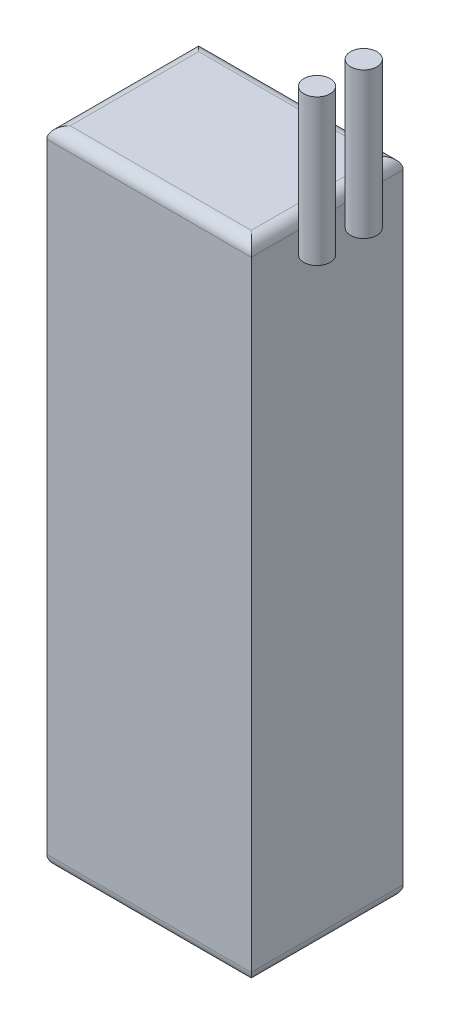
ISO-10303-21;
HEADER;
FILE_DESCRIPTION(('STEP AP214'),'2;1');
FILE_NAME('part.step','',(''),(''),'','','');
FILE_SCHEMA(('AUTOMOTIVE_DESIGN { 1 0 10303 214 1 1 1 1 }'));
ENDSEC;
DATA;
#1=APPLICATION_CONTEXT('core data for automotive mechanical design processes');
#2=APPLICATION_PROTOCOL_DEFINITION('international standard','automotive_design',2000,#1);
#3=PRODUCT_CONTEXT('',#1,'mechanical');
#4=PRODUCT('Part','Part','',(#3));
#5=PRODUCT_RELATED_PRODUCT_CATEGORY('part','',(#4));
#6=PRODUCT_DEFINITION_FORMATION('','',#4);
#7=PRODUCT_DEFINITION_CONTEXT('part definition',#1,'design');
#8=PRODUCT_DEFINITION('design','',#6,#7);
#9=PRODUCT_DEFINITION_SHAPE('','',#8);
#10=(LENGTH_UNIT() NAMED_UNIT(*) SI_UNIT(.MILLI.,.METRE.));
#11=(NAMED_UNIT(*) PLANE_ANGLE_UNIT() SI_UNIT($,.RADIAN.));
#12=(NAMED_UNIT(*) SI_UNIT($,.STERADIAN.) SOLID_ANGLE_UNIT());
#13=UNCERTAINTY_MEASURE_WITH_UNIT(LENGTH_MEASURE(1.E-05),#10,'distance_accuracy_value','');
#14=(GEOMETRIC_REPRESENTATION_CONTEXT(3) GLOBAL_UNCERTAINTY_ASSIGNED_CONTEXT((#13)) GLOBAL_UNIT_ASSIGNED_CONTEXT((#10,
#11,#12)) REPRESENTATION_CONTEXT('',''));
#15=CARTESIAN_POINT('',(0.,0.,0.));
#16=DIRECTION('',(0.,0.,1.));
#17=DIRECTION('',(1.,0.,0.));
#18=AXIS2_PLACEMENT_3D('',#15,#16,#17);
#19=CARTESIAN_POINT('',(19.75,105.,4.));
#20=DIRECTION('',(0.,1.,0.));
#21=DIRECTION('',(0.,0.,1.));
#22=AXIS2_PLACEMENT_3D('',#19,#20,#21);
#23=CYLINDRICAL_SURFACE('',#22,2.25);
#24=CARTESIAN_POINT('',(19.75,105.,4.));
#25=DIRECTION('',(0.,1.,0.));
#26=DIRECTION('',(0.,0.,-1.));
#27=AXIS2_PLACEMENT_3D('',#24,#25,#26);
#28=CIRCLE('',#27,2.25);
#29=CARTESIAN_POINT('',(19.75,105.,1.75));
#30=VERTEX_POINT('',#29);
#31=EDGE_CURVE('E11',#30,#30,#28,.T.);
#32=ORIENTED_EDGE('',*,*,#31,.T.);
#33=EDGE_LOOP('',(#32));
#34=FACE_BOUND('',#33,.T.);
#35=CARTESIAN_POINT('',(19.75,130.,4.));
#36=DIRECTION('',(0.,1.,0.));
#37=DIRECTION('',(0.,0.,-1.));
#38=AXIS2_PLACEMENT_3D('',#35,#36,#37);
#39=CIRCLE('',#38,2.25);
#40=CARTESIAN_POINT('',(19.75,130.,1.75));
#41=VERTEX_POINT('',#40);
#42=EDGE_CURVE('E53',#41,#41,#39,.T.);
#43=ORIENTED_EDGE('',*,*,#42,.F.);
#44=EDGE_LOOP('',(#43));
#45=FACE_BOUND('',#44,.T.);
#46=ADVANCED_FACE('F47',(#34,#45),#23,.T.);
#47=CARTESIAN_POINT('',(19.75,105.,4.));
#48=DIRECTION('',(0.,-1.,0.));
#49=DIRECTION('',(0.,0.,-1.));
#50=AXIS2_PLACEMENT_3D('',#47,#48,#49);
#51=PLANE('',#50);
#52=ORIENTED_EDGE('',*,*,#31,.F.);
#53=EDGE_LOOP('',(#52));
#54=FACE_BOUND('',#53,.T.);
#55=ADVANCED_FACE('F62',(#54),#51,.T.);
#56=CARTESIAN_POINT('',(19.75,130.,4.));
#57=DIRECTION('',(0.,-1.,0.));
#58=DIRECTION('',(0.,0.,-1.));
#59=AXIS2_PLACEMENT_3D('',#56,#57,#58);
#60=PLANE('',#59);
#61=ORIENTED_EDGE('',*,*,#42,.T.);
#62=EDGE_LOOP('',(#61));
#63=FACE_BOUND('',#62,.T.);
#64=ADVANCED_FACE('F59',(#63),#60,.F.);
#65=CLOSED_SHELL('',(#46,#55,#64));
#66=MANIFOLD_SOLID_BREP('B2',#65);
#67=CARTESIAN_POINT('',(19.75,105.,-4.));
#68=DIRECTION('',(0.,1.,0.));
#69=DIRECTION('',(0.,0.,1.));
#70=AXIS2_PLACEMENT_3D('',#67,#68,#69);
#71=CYLINDRICAL_SURFACE('',#70,2.25);
#72=CARTESIAN_POINT('',(19.75,105.,-4.));
#73=DIRECTION('',(0.,1.,0.));
#74=DIRECTION('',(0.,0.,1.));
#75=AXIS2_PLACEMENT_3D('',#72,#73,#74);
#76=CIRCLE('',#75,2.25);
#77=CARTESIAN_POINT('',(19.75,105.,-1.75));
#78=VERTEX_POINT('',#77);
#79=EDGE_CURVE('E46',#78,#78,#76,.T.);
#80=ORIENTED_EDGE('',*,*,#79,.T.);
#81=EDGE_LOOP('',(#80));
#82=FACE_BOUND('',#81,.T.);
#83=CARTESIAN_POINT('',(19.75,130.,-4.));
#84=DIRECTION('',(0.,1.,0.));
#85=DIRECTION('',(0.,0.,1.));
#86=AXIS2_PLACEMENT_3D('',#83,#84,#85);
#87=CIRCLE('',#86,2.25);
#88=CARTESIAN_POINT('',(19.75,130.,-1.75));
#89=VERTEX_POINT('',#88);
#90=EDGE_CURVE('E108',#89,#89,#87,.T.);
#91=ORIENTED_EDGE('',*,*,#90,.F.);
#92=EDGE_LOOP('',(#91));
#93=FACE_BOUND('',#92,.T.);
#94=ADVANCED_FACE('F102',(#82,#93),#71,.T.);
#95=CARTESIAN_POINT('',(19.75,105.,-4.));
#96=DIRECTION('',(0.,1.,0.));
#97=DIRECTION('',(0.,0.,1.));
#98=AXIS2_PLACEMENT_3D('',#95,#96,#97);
#99=PLANE('',#98);
#100=ORIENTED_EDGE('',*,*,#79,.F.);
#101=EDGE_LOOP('',(#100));
#102=FACE_BOUND('',#101,.T.);
#103=ADVANCED_FACE('F117',(#102),#99,.F.);
#104=CARTESIAN_POINT('',(19.75,130.,-4.));
#105=DIRECTION('',(0.,1.,0.));
#106=DIRECTION('',(0.,0.,1.));
#107=AXIS2_PLACEMENT_3D('',#104,#105,#106);
#108=PLANE('',#107);
#109=ORIENTED_EDGE('',*,*,#90,.T.);
#110=EDGE_LOOP('',(#109));
#111=FACE_BOUND('',#110,.T.);
#112=ADVANCED_FACE('F114',(#111),#108,.T.);
#113=CLOSED_SHELL('',(#94,#103,#112));
#114=MANIFOLD_SOLID_BREP('B6',#113);
#115=CARTESIAN_POINT('',(17.5,110.,-13.));
#116=DIRECTION('',(-1.,0.,0.));
#117=DIRECTION('',(0.,0.,1.));
#118=AXIS2_PLACEMENT_3D('',#115,#116,#117);
#119=PLANE('',#118);
#120=DIRECTION('',(0.,-1.,0.));
#121=VECTOR('',#120,1.);
#122=CARTESIAN_POINT('',(17.5,110.,-13.));
#123=LINE('',#122,#121);
#124=CARTESIAN_POINT('',(17.5,108.,-13.));
#125=VERTEX_POINT('',#124);
#126=CARTESIAN_POINT('',(17.5,2.,-13.));
#127=VERTEX_POINT('',#126);
#128=EDGE_CURVE('E236',#125,#127,#123,.T.);
#129=ORIENTED_EDGE('',*,*,#128,.F.);
#130=DIRECTION('',(0.,0.,-1.));
#131=VECTOR('',#130,1.);
#132=CARTESIAN_POINT('',(17.5,108.,13.));
#133=LINE('',#132,#131);
#134=CARTESIAN_POINT('',(17.5,108.,13.));
#135=VERTEX_POINT('',#134);
#136=EDGE_CURVE('E269',#125,#135,#133,.F.);
#137=ORIENTED_EDGE('',*,*,#136,.T.);
#138=DIRECTION('',(0.,-1.,0.));
#139=VECTOR('',#138,1.);
#140=CARTESIAN_POINT('',(17.5,110.,13.));
#141=LINE('',#140,#139);
#142=CARTESIAN_POINT('',(17.5,2.,13.));
#143=VERTEX_POINT('',#142);
#144=EDGE_CURVE('E287',#135,#143,#141,.T.);
#145=ORIENTED_EDGE('',*,*,#144,.T.);
#146=DIRECTION('',(0.,0.,-1.));
#147=VECTOR('',#146,1.);
#148=CARTESIAN_POINT('',(17.5,2.,-13.));
#149=LINE('',#148,#147);
#150=EDGE_CURVE('E266',#143,#127,#149,.T.);
#151=ORIENTED_EDGE('',*,*,#150,.T.);
#152=EDGE_LOOP('',(#129,#137,#145,#151));
#153=FACE_BOUND('',#152,.T.);
#154=ADVANCED_FACE('F148',(#153),#119,.F.);
#155=CARTESIAN_POINT('',(-17.5,110.,-13.));
#156=DIRECTION('',(0.,0.,1.));
#157=DIRECTION('',(1.,0.,0.));
#158=AXIS2_PLACEMENT_3D('',#155,#156,#157);
#159=PLANE('',#158);
#160=DIRECTION('',(0.,-1.,0.));
#161=VECTOR('',#160,1.);
#162=CARTESIAN_POINT('',(-17.5,110.,-13.));
#163=LINE('',#162,#161);
#164=CARTESIAN_POINT('',(-17.5,108.,-13.));
#165=VERTEX_POINT('',#164);
#166=CARTESIAN_POINT('',(-17.5,2.,-13.));
#167=VERTEX_POINT('',#166);
#168=EDGE_CURVE('E417',#165,#167,#163,.T.);
#169=ORIENTED_EDGE('',*,*,#168,.F.);
#170=DIRECTION('',(-1.,0.,0.));
#171=VECTOR('',#170,1.);
#172=CARTESIAN_POINT('',(17.5,108.,-13.));
#173=LINE('',#172,#171);
#174=EDGE_CURVE('E263',#165,#125,#173,.F.);
#175=ORIENTED_EDGE('',*,*,#174,.T.);
#176=ORIENTED_EDGE('',*,*,#128,.T.);
#177=DIRECTION('',(-1.,0.,0.));
#178=VECTOR('',#177,1.);
#179=CARTESIAN_POINT('',(-17.5,2.,-13.));
#180=LINE('',#179,#178);
#181=EDGE_CURVE('E259',#127,#167,#180,.T.);
#182=ORIENTED_EDGE('',*,*,#181,.T.);
#183=EDGE_LOOP('',(#169,#175,#176,#182));
#184=FACE_BOUND('',#183,.T.);
#185=ADVANCED_FACE('F329',(#184),#159,.F.);
#186=CARTESIAN_POINT('',(-17.5,110.,-13.));
#187=DIRECTION('',(1.,0.,0.));
#188=DIRECTION('',(0.,0.,-1.));
#189=AXIS2_PLACEMENT_3D('',#186,#187,#188);
#190=PLANE('',#189);
#191=DIRECTION('',(0.,-1.,0.));
#192=VECTOR('',#191,1.);
#193=CARTESIAN_POINT('',(-17.5,110.,13.));
#194=LINE('',#193,#192);
#195=CARTESIAN_POINT('',(-17.5,108.,13.));
#196=VERTEX_POINT('',#195);
#197=CARTESIAN_POINT('',(-17.5,2.,13.));
#198=VERTEX_POINT('',#197);
#199=EDGE_CURVE('E412',#196,#198,#194,.T.);
#200=ORIENTED_EDGE('',*,*,#199,.F.);
#201=DIRECTION('',(0.,0.,1.));
#202=VECTOR('',#201,1.);
#203=CARTESIAN_POINT('',(-17.5,108.,-13.));
#204=LINE('',#203,#202);
#205=EDGE_CURVE('E256',#196,#165,#204,.F.);
#206=ORIENTED_EDGE('',*,*,#205,.T.);
#207=ORIENTED_EDGE('',*,*,#168,.T.);
#208=DIRECTION('',(0.,0.,1.));
#209=VECTOR('',#208,1.);
#210=CARTESIAN_POINT('',(-17.5,2.,-13.));
#211=LINE('',#210,#209);
#212=EDGE_CURVE('E253',#167,#198,#211,.T.);
#213=ORIENTED_EDGE('',*,*,#212,.T.);
#214=EDGE_LOOP('',(#200,#206,#207,#213));
#215=FACE_BOUND('',#214,.T.);
#216=ADVANCED_FACE('F335',(#215),#190,.F.);
#217=CARTESIAN_POINT('',(-17.5,110.,13.));
#218=DIRECTION('',(0.,0.,-1.));
#219=DIRECTION('',(-1.,0.,0.));
#220=AXIS2_PLACEMENT_3D('',#217,#218,#219);
#221=PLANE('',#220);
#222=ORIENTED_EDGE('',*,*,#144,.F.);
#223=DIRECTION('',(1.,0.,0.));
#224=VECTOR('',#223,1.);
#225=CARTESIAN_POINT('',(-17.5,108.,13.));
#226=LINE('',#225,#224);
#227=EDGE_CURVE('E221',#135,#196,#226,.F.);
#228=ORIENTED_EDGE('',*,*,#227,.T.);
#229=ORIENTED_EDGE('',*,*,#199,.T.);
#230=DIRECTION('',(1.,0.,0.));
#231=VECTOR('',#230,1.);
#232=CARTESIAN_POINT('',(-17.5,2.,13.));
#233=LINE('',#232,#231);
#234=EDGE_CURVE('E243',#198,#143,#233,.T.);
#235=ORIENTED_EDGE('',*,*,#234,.T.);
#236=EDGE_LOOP('',(#222,#228,#229,#235));
#237=FACE_BOUND('',#236,.T.);
#238=ADVANCED_FACE('F325',(#237),#221,.F.);
#239=CARTESIAN_POINT('',(0.,110.,0.));
#240=DIRECTION('',(0.,1.,0.));
#241=DIRECTION('',(0.,0.,1.));
#242=AXIS2_PLACEMENT_3D('',#239,#240,#241);
#243=PLANE('',#242);
#244=DIRECTION('',(0.,0.,1.));
#245=VECTOR('',#244,1.);
#246=CARTESIAN_POINT('',(-15.5,110.,13.));
#247=LINE('',#246,#245);
#248=CARTESIAN_POINT('',(-15.5,110.,-11.));
#249=VERTEX_POINT('',#248);
#250=CARTESIAN_POINT('',(-15.5,110.,11.));
#251=VERTEX_POINT('',#250);
#252=EDGE_CURVE('E240',#249,#251,#247,.T.);
#253=ORIENTED_EDGE('',*,*,#252,.T.);
#254=DIRECTION('',(1.,0.,0.));
#255=VECTOR('',#254,1.);
#256=CARTESIAN_POINT('',(17.5,110.,11.));
#257=LINE('',#256,#255);
#258=CARTESIAN_POINT('',(15.5,110.,11.));
#259=VERTEX_POINT('',#258);
#260=EDGE_CURVE('E219',#251,#259,#257,.T.);
#261=ORIENTED_EDGE('',*,*,#260,.T.);
#262=DIRECTION('',(0.,0.,-1.));
#263=VECTOR('',#262,1.);
#264=CARTESIAN_POINT('',(15.5,110.,-13.));
#265=LINE('',#264,#263);
#266=CARTESIAN_POINT('',(15.5,110.,-11.));
#267=VERTEX_POINT('',#266);
#268=EDGE_CURVE('E228',#259,#267,#265,.T.);
#269=ORIENTED_EDGE('',*,*,#268,.T.);
#270=DIRECTION('',(-1.,0.,0.));
#271=VECTOR('',#270,1.);
#272=CARTESIAN_POINT('',(-17.5,110.,-11.));
#273=LINE('',#272,#271);
#274=EDGE_CURVE('E235',#267,#249,#273,.T.);
#275=ORIENTED_EDGE('',*,*,#274,.T.);
#276=EDGE_LOOP('',(#253,#261,#269,#275));
#277=FACE_BOUND('',#276,.T.);
#278=ADVANCED_FACE('F238',(#277),#243,.T.);
#279=CARTESIAN_POINT('',(0.,0.,0.));
#280=DIRECTION('',(0.,1.,0.));
#281=DIRECTION('',(0.,0.,1.));
#282=AXIS2_PLACEMENT_3D('',#279,#280,#281);
#283=PLANE('',#282);
#284=DIRECTION('',(0.,0.,1.));
#285=VECTOR('',#284,1.);
#286=CARTESIAN_POINT('',(-15.5,0.,0.));
#287=LINE('',#286,#285);
#288=CARTESIAN_POINT('',(-15.5,0.,11.));
#289=VERTEX_POINT('',#288);
#290=CARTESIAN_POINT('',(-15.5,0.,-11.));
#291=VERTEX_POINT('',#290);
#292=EDGE_CURVE('E158',#289,#291,#287,.F.);
#293=ORIENTED_EDGE('',*,*,#292,.T.);
#294=DIRECTION('',(-1.,0.,0.));
#295=VECTOR('',#294,1.);
#296=CARTESIAN_POINT('',(0.,0.,-11.));
#297=LINE('',#296,#295);
#298=CARTESIAN_POINT('',(15.5,0.,-11.));
#299=VERTEX_POINT('',#298);
#300=EDGE_CURVE('E100',#291,#299,#297,.F.);
#301=ORIENTED_EDGE('',*,*,#300,.T.);
#302=DIRECTION('',(0.,0.,-1.));
#303=VECTOR('',#302,1.);
#304=CARTESIAN_POINT('',(15.5,0.,0.));
#305=LINE('',#304,#303);
#306=CARTESIAN_POINT('',(15.5,0.,11.));
#307=VERTEX_POINT('',#306);
#308=EDGE_CURVE('E272',#299,#307,#305,.F.);
#309=ORIENTED_EDGE('',*,*,#308,.T.);
#310=DIRECTION('',(1.,0.,0.));
#311=VECTOR('',#310,1.);
#312=CARTESIAN_POINT('',(0.,0.,11.));
#313=LINE('',#312,#311);
#314=EDGE_CURVE('E169',#307,#289,#313,.F.);
#315=ORIENTED_EDGE('',*,*,#314,.T.);
#316=EDGE_LOOP('',(#293,#301,#309,#315));
#317=FACE_BOUND('',#316,.T.);
#318=ADVANCED_FACE('F313',(#317),#283,.F.);
#319=CARTESIAN_POINT('',(0.,108.,-11.));
#320=DIRECTION('',(1.,0.,0.));
#321=DIRECTION('',(0.,0.,-1.));
#322=AXIS2_PLACEMENT_3D('',#319,#320,#321);
#323=CYLINDRICAL_SURFACE('',#322,2.);
#324=CARTESIAN_POINT('',(15.5,108.,-11.));
#325=DIRECTION('',(0.707106781186547,0.,0.707106781186548));
#326=DIRECTION('',(-0.707106781186548,0.,0.707106781186547));
#327=AXIS2_PLACEMENT_3D('',#324,#325,#326);
#328=ELLIPSE('',#327,2.82842712474619,2.);
#329=EDGE_CURVE('E231',#125,#267,#328,.T.);
#330=ORIENTED_EDGE('',*,*,#329,.F.);
#331=ORIENTED_EDGE('',*,*,#174,.F.);
#332=CARTESIAN_POINT('',(-15.5,108.,-11.));
#333=DIRECTION('',(0.707106781186547,0.,-0.707106781186548));
#334=DIRECTION('',(0.707106781186548,0.,0.707106781186547));
#335=AXIS2_PLACEMENT_3D('',#332,#333,#334);
#336=ELLIPSE('',#335,2.82842712474619,2.);
#337=EDGE_CURVE('E283',#249,#165,#336,.F.);
#338=ORIENTED_EDGE('',*,*,#337,.F.);
#339=ORIENTED_EDGE('',*,*,#274,.F.);
#340=EDGE_LOOP('',(#330,#331,#338,#339));
#341=FACE_BOUND('',#340,.T.);
#342=ADVANCED_FACE('F315',(#341),#323,.T.);
#343=CARTESIAN_POINT('',(-15.5,108.,0.));
#344=DIRECTION('',(0.,0.,-1.));
#345=DIRECTION('',(-1.,0.,0.));
#346=AXIS2_PLACEMENT_3D('',#343,#344,#345);
#347=CYLINDRICAL_SURFACE('',#346,2.);
#348=ORIENTED_EDGE('',*,*,#337,.T.);
#349=ORIENTED_EDGE('',*,*,#205,.F.);
#350=CARTESIAN_POINT('',(-15.5,108.,11.));
#351=DIRECTION('',(-0.707106781186548,0.,-0.707106781186547));
#352=DIRECTION('',(0.707106781186547,0.,-0.707106781186548));
#353=AXIS2_PLACEMENT_3D('',#350,#351,#352);
#354=ELLIPSE('',#353,2.82842712474619,2.);
#355=EDGE_CURVE('E225',#251,#196,#354,.F.);
#356=ORIENTED_EDGE('',*,*,#355,.F.);
#357=ORIENTED_EDGE('',*,*,#252,.F.);
#358=EDGE_LOOP('',(#348,#349,#356,#357));
#359=FACE_BOUND('',#358,.T.);
#360=ADVANCED_FACE('F322',(#359),#347,.T.);
#361=CARTESIAN_POINT('',(15.5,108.,0.));
#362=DIRECTION('',(0.,0.,1.));
#363=DIRECTION('',(1.,0.,0.));
#364=AXIS2_PLACEMENT_3D('',#361,#362,#363);
#365=CYLINDRICAL_SURFACE('',#364,2.);
#366=ORIENTED_EDGE('',*,*,#329,.T.);
#367=ORIENTED_EDGE('',*,*,#268,.F.);
#368=CARTESIAN_POINT('',(15.5,108.,11.));
#369=DIRECTION('',(-0.707106781186548,0.,0.707106781186547));
#370=DIRECTION('',(0.707106781186547,0.,0.707106781186548));
#371=AXIS2_PLACEMENT_3D('',#368,#369,#370);
#372=ELLIPSE('',#371,2.82842712474619,2.);
#373=EDGE_CURVE('E215',#135,#259,#372,.T.);
#374=ORIENTED_EDGE('',*,*,#373,.F.);
#375=ORIENTED_EDGE('',*,*,#136,.F.);
#376=EDGE_LOOP('',(#366,#367,#374,#375));
#377=FACE_BOUND('',#376,.T.);
#378=ADVANCED_FACE('F229',(#377),#365,.T.);
#379=CARTESIAN_POINT('',(0.,108.,11.));
#380=DIRECTION('',(-1.,0.,0.));
#381=DIRECTION('',(0.,0.,1.));
#382=AXIS2_PLACEMENT_3D('',#379,#380,#381);
#383=CYLINDRICAL_SURFACE('',#382,2.);
#384=ORIENTED_EDGE('',*,*,#355,.T.);
#385=ORIENTED_EDGE('',*,*,#227,.F.);
#386=ORIENTED_EDGE('',*,*,#373,.T.);
#387=ORIENTED_EDGE('',*,*,#260,.F.);
#388=EDGE_LOOP('',(#384,#385,#386,#387));
#389=FACE_BOUND('',#388,.T.);
#390=ADVANCED_FACE('F217',(#389),#383,.T.);
#391=CARTESIAN_POINT('',(-17.5,2.,11.));
#392=DIRECTION('',(1.,0.,0.));
#393=DIRECTION('',(0.,0.,-1.));
#394=AXIS2_PLACEMENT_3D('',#391,#392,#393);
#395=CYLINDRICAL_SURFACE('',#394,2.);
#396=CARTESIAN_POINT('',(-15.5,2.,11.));
#397=DIRECTION('',(0.707106781186548,0.,0.707106781186547));
#398=DIRECTION('',(0.707106781186547,0.,-0.707106781186548));
#399=AXIS2_PLACEMENT_3D('',#396,#397,#398);
#400=ELLIPSE('',#399,2.82842712474619,2.);
#401=EDGE_CURVE('E293',#289,#198,#400,.F.);
#402=ORIENTED_EDGE('',*,*,#401,.F.);
#403=ORIENTED_EDGE('',*,*,#314,.F.);
#404=CARTESIAN_POINT('',(15.5,2.,11.));
#405=DIRECTION('',(0.707106781186548,0.,-0.707106781186547));
#406=DIRECTION('',(-0.707106781186547,0.,-0.707106781186548));
#407=AXIS2_PLACEMENT_3D('',#404,#405,#406);
#408=ELLIPSE('',#407,2.82842712474619,2.);
#409=EDGE_CURVE('E152',#143,#307,#408,.T.);
#410=ORIENTED_EDGE('',*,*,#409,.F.);
#411=ORIENTED_EDGE('',*,*,#234,.F.);
#412=EDGE_LOOP('',(#402,#403,#410,#411));
#413=FACE_BOUND('',#412,.T.);
#414=ADVANCED_FACE('F150',(#413),#395,.T.);
#415=CARTESIAN_POINT('',(15.5,2.,-13.));
#416=DIRECTION('',(0.,0.,-1.));
#417=DIRECTION('',(-1.,0.,0.));
#418=AXIS2_PLACEMENT_3D('',#415,#416,#417);
#419=CYLINDRICAL_SURFACE('',#418,2.);
#420=ORIENTED_EDGE('',*,*,#409,.T.);
#421=ORIENTED_EDGE('',*,*,#308,.F.);
#422=CARTESIAN_POINT('',(15.5,2.,-11.));
#423=DIRECTION('',(-0.707106781186547,0.,-0.707106781186548));
#424=DIRECTION('',(0.707106781186548,0.,-0.707106781186547));
#425=AXIS2_PLACEMENT_3D('',#422,#423,#424);
#426=ELLIPSE('',#425,2.82842712474619,2.);
#427=EDGE_CURVE('E291',#127,#299,#426,.T.);
#428=ORIENTED_EDGE('',*,*,#427,.F.);
#429=ORIENTED_EDGE('',*,*,#150,.F.);
#430=EDGE_LOOP('',(#420,#421,#428,#429));
#431=FACE_BOUND('',#430,.T.);
#432=ADVANCED_FACE('F304',(#431),#419,.T.);
#433=CARTESIAN_POINT('',(-15.5,2.,-13.));
#434=DIRECTION('',(0.,0.,1.));
#435=DIRECTION('',(1.,0.,0.));
#436=AXIS2_PLACEMENT_3D('',#433,#434,#435);
#437=CYLINDRICAL_SURFACE('',#436,2.);
#438=ORIENTED_EDGE('',*,*,#401,.T.);
#439=ORIENTED_EDGE('',*,*,#212,.F.);
#440=CARTESIAN_POINT('',(-15.5,2.,-11.));
#441=DIRECTION('',(-0.707106781186547,0.,0.707106781186548));
#442=DIRECTION('',(0.707106781186548,0.,0.707106781186547));
#443=AXIS2_PLACEMENT_3D('',#440,#441,#442);
#444=ELLIPSE('',#443,2.82842712474619,2.);
#445=EDGE_CURVE('E288',#291,#167,#444,.F.);
#446=ORIENTED_EDGE('',*,*,#445,.F.);
#447=ORIENTED_EDGE('',*,*,#292,.F.);
#448=EDGE_LOOP('',(#438,#439,#446,#447));
#449=FACE_BOUND('',#448,.T.);
#450=ADVANCED_FACE('F309',(#449),#437,.T.);
#451=CARTESIAN_POINT('',(-17.5,2.,-11.));
#452=DIRECTION('',(-1.,0.,0.));
#453=DIRECTION('',(0.,0.,1.));
#454=AXIS2_PLACEMENT_3D('',#451,#452,#453);
#455=CYLINDRICAL_SURFACE('',#454,2.);
#456=ORIENTED_EDGE('',*,*,#427,.T.);
#457=ORIENTED_EDGE('',*,*,#300,.F.);
#458=ORIENTED_EDGE('',*,*,#445,.T.);
#459=ORIENTED_EDGE('',*,*,#181,.F.);
#460=EDGE_LOOP('',(#456,#457,#458,#459));
#461=FACE_BOUND('',#460,.T.);
#462=ADVANCED_FACE('F312',(#461),#455,.T.);
#463=CLOSED_SHELL('',(#154,#185,#216,#238,#278,#318,#342,#360,#378,#390,#414,#432,#450,#462));
#464=MANIFOLD_SOLID_BREP('B41',#463);
#465=ADVANCED_BREP_SHAPE_REPRESENTATION('',(#18,#66,#114,#464),#14);
#466=SHAPE_DEFINITION_REPRESENTATION(#9,#465);
ENDSEC;
END-ISO-10303-21;
